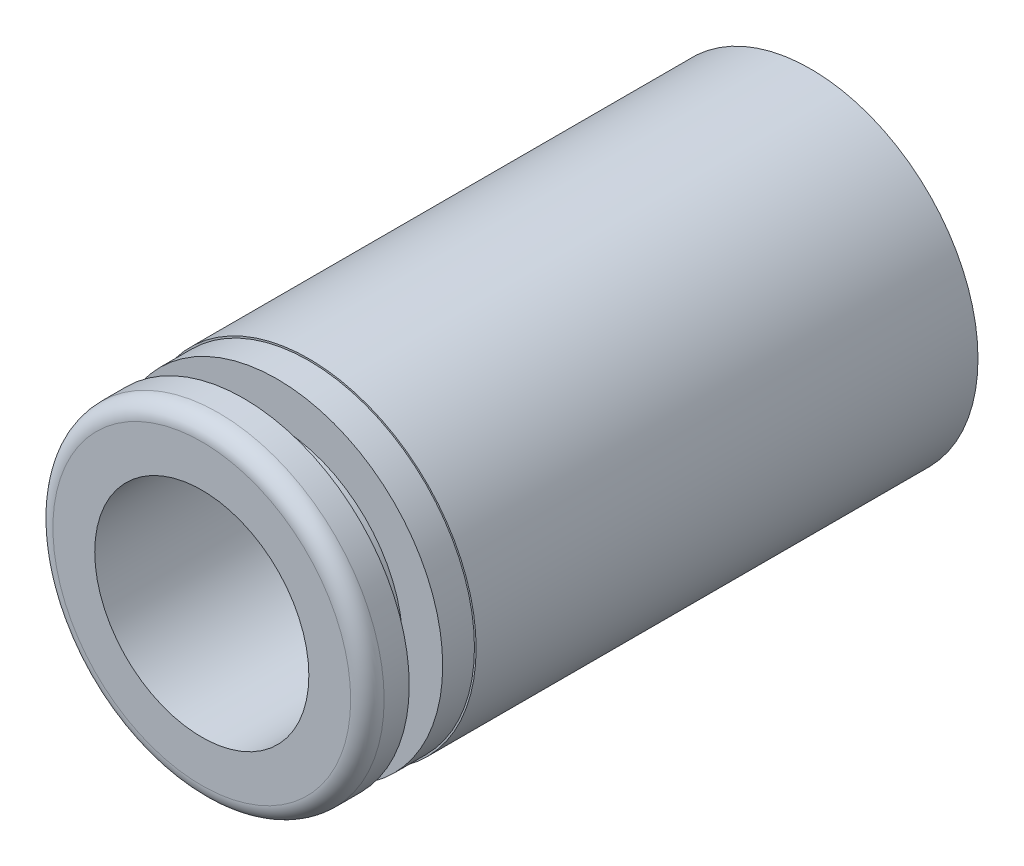
ISO-10303-21;
HEADER;
FILE_DESCRIPTION(('STEP AP214'),'2;1');
FILE_NAME('part.step','',(''),(''),'','','');
FILE_SCHEMA(('AUTOMOTIVE_DESIGN { 1 0 10303 214 1 1 1 1 }'));
ENDSEC;
DATA;
#1=APPLICATION_CONTEXT('core data for automotive mechanical design processes');
#2=APPLICATION_PROTOCOL_DEFINITION('international standard','automotive_design',2000,#1);
#3=PRODUCT_CONTEXT('',#1,'mechanical');
#4=PRODUCT('Part','Part','',(#3));
#5=PRODUCT_RELATED_PRODUCT_CATEGORY('part','',(#4));
#6=PRODUCT_DEFINITION_FORMATION('','',#4);
#7=PRODUCT_DEFINITION_CONTEXT('part definition',#1,'design');
#8=PRODUCT_DEFINITION('design','',#6,#7);
#9=PRODUCT_DEFINITION_SHAPE('','',#8);
#10=(LENGTH_UNIT() NAMED_UNIT(*) SI_UNIT(.MILLI.,.METRE.));
#11=(NAMED_UNIT(*) PLANE_ANGLE_UNIT() SI_UNIT($,.RADIAN.));
#12=(NAMED_UNIT(*) SI_UNIT($,.STERADIAN.) SOLID_ANGLE_UNIT());
#13=UNCERTAINTY_MEASURE_WITH_UNIT(LENGTH_MEASURE(1.E-05),#10,'distance_accuracy_value','');
#14=(GEOMETRIC_REPRESENTATION_CONTEXT(3) GLOBAL_UNCERTAINTY_ASSIGNED_CONTEXT((#13)) GLOBAL_UNIT_ASSIGNED_CONTEXT((#10,
#11,#12)) REPRESENTATION_CONTEXT('',''));
#15=CARTESIAN_POINT('',(0.,0.,0.));
#16=DIRECTION('',(0.,0.,1.));
#17=DIRECTION('',(1.,0.,0.));
#18=AXIS2_PLACEMENT_3D('',#15,#16,#17);
#19=CARTESIAN_POINT('',(0.,0.,15.95));
#20=DIRECTION('',(0.,0.,1.));
#21=DIRECTION('',(1.,0.,0.));
#22=AXIS2_PLACEMENT_3D('',#19,#20,#21);
#23=PLANE('',#22);
#24=CARTESIAN_POINT('',(0.,0.,15.95));
#25=DIRECTION('',(0.,0.,1.));
#26=DIRECTION('',(1.,0.,0.));
#27=AXIS2_PLACEMENT_3D('',#24,#25,#26);
#28=CIRCLE('',#27,4.95);
#29=CARTESIAN_POINT('',(-4.95,0.,15.95));
#30=VERTEX_POINT('',#29);
#31=EDGE_CURVE('E53',#30,#30,#28,.T.);
#32=ORIENTED_EDGE('',*,*,#31,.T.);
#33=EDGE_LOOP('',(#32));
#34=FACE_BOUND('',#33,.T.);
#35=CARTESIAN_POINT('',(0.,0.,15.95));
#36=DIRECTION('',(0.,0.,1.));
#37=DIRECTION('',(1.,0.,0.));
#38=AXIS2_PLACEMENT_3D('',#35,#36,#37);
#39=CIRCLE('',#38,3.75);
#40=CARTESIAN_POINT('',(3.75,0.,15.95));
#41=VERTEX_POINT('',#40);
#42=EDGE_CURVE('E60',#41,#41,#39,.T.);
#43=ORIENTED_EDGE('',*,*,#42,.F.);
#44=EDGE_LOOP('',(#43));
#45=FACE_BOUND('',#44,.T.);
#46=ADVANCED_FACE('F30',(#34,#45),#23,.T.);
#47=CARTESIAN_POINT('',(0.,0.,15.));
#48=DIRECTION('',(0.,0.,1.));
#49=DIRECTION('',(1.,0.,0.));
#50=AXIS2_PLACEMENT_3D('',#47,#48,#49);
#51=PLANE('',#50);
#52=CARTESIAN_POINT('',(0.,0.,15.));
#53=DIRECTION('',(0.,0.,1.));
#54=DIRECTION('',(1.,0.,0.));
#55=AXIS2_PLACEMENT_3D('',#52,#53,#54);
#56=CIRCLE('',#55,5.);
#57=CARTESIAN_POINT('',(5.,0.,15.));
#58=VERTEX_POINT('',#57);
#59=EDGE_CURVE('E41',#58,#58,#56,.T.);
#60=ORIENTED_EDGE('',*,*,#59,.T.);
#61=EDGE_LOOP('',(#60));
#62=FACE_BOUND('',#61,.T.);
#63=CARTESIAN_POINT('',(0.,0.,15.));
#64=DIRECTION('',(0.,0.,1.));
#65=DIRECTION('',(1.,0.,0.));
#66=AXIS2_PLACEMENT_3D('',#63,#64,#65);
#67=CIRCLE('',#66,4.95);
#68=CARTESIAN_POINT('',(-4.95,0.,15.));
#69=VERTEX_POINT('',#68);
#70=EDGE_CURVE('E54',#69,#69,#67,.T.);
#71=ORIENTED_EDGE('',*,*,#70,.F.);
#72=EDGE_LOOP('',(#71));
#73=FACE_BOUND('',#72,.T.);
#74=ADVANCED_FACE('F88',(#62,#73),#51,.T.);
#75=CARTESIAN_POINT('',(0.,0.,0.));
#76=DIRECTION('',(0.,0.,1.));
#77=DIRECTION('',(1.,0.,0.));
#78=AXIS2_PLACEMENT_3D('',#75,#76,#77);
#79=PLANE('',#78);
#80=CARTESIAN_POINT('',(0.,0.,0.));
#81=DIRECTION('',(0.,0.,1.));
#82=DIRECTION('',(1.,0.,0.));
#83=AXIS2_PLACEMENT_3D('',#80,#81,#82);
#84=CIRCLE('',#83,5.);
#85=CARTESIAN_POINT('',(5.,0.,0.));
#86=VERTEX_POINT('',#85);
#87=EDGE_CURVE('E45',#86,#86,#84,.T.);
#88=ORIENTED_EDGE('',*,*,#87,.F.);
#89=EDGE_LOOP('',(#88));
#90=FACE_BOUND('',#89,.T.);
#91=CARTESIAN_POINT('',(0.,0.,0.));
#92=DIRECTION('',(0.,0.,1.));
#93=DIRECTION('',(1.,0.,0.));
#94=AXIS2_PLACEMENT_3D('',#91,#92,#93);
#95=CIRCLE('',#94,3.2);
#96=CARTESIAN_POINT('',(3.2,0.,0.));
#97=VERTEX_POINT('',#96);
#98=EDGE_CURVE('E49',#97,#97,#95,.T.);
#99=ORIENTED_EDGE('',*,*,#98,.T.);
#100=EDGE_LOOP('',(#99));
#101=FACE_BOUND('',#100,.T.);
#102=ADVANCED_FACE('F94',(#90,#101),#79,.F.);
#103=CARTESIAN_POINT('',(0.,0.,15.));
#104=DIRECTION('',(0.,0.,-1.));
#105=DIRECTION('',(-1.,0.,0.));
#106=AXIS2_PLACEMENT_3D('',#103,#104,#105);
#107=CYLINDRICAL_SURFACE('',#106,5.);
#108=ORIENTED_EDGE('',*,*,#59,.F.);
#109=EDGE_LOOP('',(#108));
#110=FACE_BOUND('',#109,.T.);
#111=ORIENTED_EDGE('',*,*,#87,.T.);
#112=EDGE_LOOP('',(#111));
#113=FACE_BOUND('',#112,.T.);
#114=ADVANCED_FACE('F105',(#110,#113),#107,.T.);
#115=CARTESIAN_POINT('',(0.,0.,15.));
#116=DIRECTION('',(0.,0.,-1.));
#117=DIRECTION('',(-1.,0.,0.));
#118=AXIS2_PLACEMENT_3D('',#115,#116,#117);
#119=CYLINDRICAL_SURFACE('',#118,3.2);
#120=ORIENTED_EDGE('',*,*,#98,.F.);
#121=EDGE_LOOP('',(#120));
#122=FACE_BOUND('',#121,.T.);
#123=CARTESIAN_POINT('',(0.,0.,18.2));
#124=DIRECTION('',(0.,0.,1.));
#125=DIRECTION('',(1.,0.,0.));
#126=AXIS2_PLACEMENT_3D('',#123,#124,#125);
#127=CIRCLE('',#126,3.2);
#128=CARTESIAN_POINT('',(3.2,0.,18.2));
#129=VERTEX_POINT('',#128);
#130=EDGE_CURVE('E68',#129,#129,#127,.T.);
#131=ORIENTED_EDGE('',*,*,#130,.T.);
#132=EDGE_LOOP('',(#131));
#133=FACE_BOUND('',#132,.T.);
#134=ADVANCED_FACE('F72',(#122,#133),#119,.F.);
#135=CARTESIAN_POINT('',(0.,0.,15.95));
#136=DIRECTION('',(0.,0.,-1.));
#137=DIRECTION('',(-1.,0.,0.));
#138=AXIS2_PLACEMENT_3D('',#135,#136,#137);
#139=CYLINDRICAL_SURFACE('',#138,4.95);
#140=CARTESIAN_POINT('',(-4.95,0.,15.95));
#141=CARTESIAN_POINT('',(-4.95,0.,15.9401041666667));
#142=CARTESIAN_POINT('',(-4.95,0.,15.9302083333333));
#143=CARTESIAN_POINT('',(-4.95,0.,15.9104166666667));
#144=CARTESIAN_POINT('',(-4.95,0.,15.9005208333333));
#145=CARTESIAN_POINT('',(-4.95,0.,15.8807291666667));
#146=CARTESIAN_POINT('',(-4.95,0.,15.8708333333333));
#147=CARTESIAN_POINT('',(-4.95,0.,15.8510416666667));
#148=CARTESIAN_POINT('',(-4.95,0.,15.8411458333333));
#149=CARTESIAN_POINT('',(-4.95,0.,15.8213541666667));
#150=CARTESIAN_POINT('',(-4.95,0.,15.8114583333333));
#151=CARTESIAN_POINT('',(-4.95,0.,15.7916666666667));
#152=CARTESIAN_POINT('',(-4.95,0.,15.7817708333333));
#153=CARTESIAN_POINT('',(-4.95,0.,15.7619791666667));
#154=CARTESIAN_POINT('',(-4.95,0.,15.7520833333333));
#155=CARTESIAN_POINT('',(-4.95,0.,15.7322916666667));
#156=CARTESIAN_POINT('',(-4.95,0.,15.7223958333333));
#157=CARTESIAN_POINT('',(-4.95,0.,15.7026041666667));
#158=CARTESIAN_POINT('',(-4.95,0.,15.6927083333333));
#159=CARTESIAN_POINT('',(-4.95,0.,15.6729166666667));
#160=CARTESIAN_POINT('',(-4.95,0.,15.6630208333333));
#161=CARTESIAN_POINT('',(-4.95,0.,15.6432291666667));
#162=CARTESIAN_POINT('',(-4.95,0.,15.6333333333333));
#163=CARTESIAN_POINT('',(-4.95,0.,15.6135416666667));
#164=CARTESIAN_POINT('',(-4.95,0.,15.6036458333333));
#165=CARTESIAN_POINT('',(-4.95,0.,15.5838541666667));
#166=CARTESIAN_POINT('',(-4.95,0.,15.5739583333333));
#167=CARTESIAN_POINT('',(-4.95,0.,15.5541666666667));
#168=CARTESIAN_POINT('',(-4.95,0.,15.5442708333333));
#169=CARTESIAN_POINT('',(-4.95,0.,15.5244791666667));
#170=CARTESIAN_POINT('',(-4.95,0.,15.5145833333333));
#171=CARTESIAN_POINT('',(-4.95,0.,15.4947916666667));
#172=CARTESIAN_POINT('',(-4.95,0.,15.4848958333333));
#173=CARTESIAN_POINT('',(-4.95,0.,15.4651041666667));
#174=CARTESIAN_POINT('',(-4.95,0.,15.4552083333333));
#175=CARTESIAN_POINT('',(-4.95,0.,15.4354166666667));
#176=CARTESIAN_POINT('',(-4.95,0.,15.4255208333333));
#177=CARTESIAN_POINT('',(-4.95,0.,15.4057291666667));
#178=CARTESIAN_POINT('',(-4.95,0.,15.3958333333333));
#179=CARTESIAN_POINT('',(-4.95,0.,15.3760416666667));
#180=CARTESIAN_POINT('',(-4.95,0.,15.3661458333333));
#181=CARTESIAN_POINT('',(-4.95,0.,15.3463541666667));
#182=CARTESIAN_POINT('',(-4.95,0.,15.3364583333333));
#183=CARTESIAN_POINT('',(-4.95,0.,15.3166666666667));
#184=CARTESIAN_POINT('',(-4.95,0.,15.3067708333333));
#185=CARTESIAN_POINT('',(-4.95,0.,15.2869791666667));
#186=CARTESIAN_POINT('',(-4.95,0.,15.2770833333333));
#187=CARTESIAN_POINT('',(-4.95,0.,15.2572916666667));
#188=CARTESIAN_POINT('',(-4.95,0.,15.2473958333333));
#189=CARTESIAN_POINT('',(-4.95,0.,15.2276041666667));
#190=CARTESIAN_POINT('',(-4.95,0.,15.2177083333333));
#191=CARTESIAN_POINT('',(-4.95,0.,15.1979166666667));
#192=CARTESIAN_POINT('',(-4.95,0.,15.1880208333333));
#193=CARTESIAN_POINT('',(-4.95,0.,15.1682291666667));
#194=CARTESIAN_POINT('',(-4.95,0.,15.1583333333333));
#195=CARTESIAN_POINT('',(-4.95,0.,15.1385416666667));
#196=CARTESIAN_POINT('',(-4.95,0.,15.1286458333333));
#197=CARTESIAN_POINT('',(-4.95,0.,15.1088541666667));
#198=CARTESIAN_POINT('',(-4.95,0.,15.0989583333333));
#199=CARTESIAN_POINT('',(-4.95,0.,15.0791666666667));
#200=CARTESIAN_POINT('',(-4.95,0.,15.0692708333333));
#201=CARTESIAN_POINT('',(-4.95,0.,15.0494791666667));
#202=CARTESIAN_POINT('',(-4.95,0.,15.0395833333333));
#203=CARTESIAN_POINT('',(-4.95,0.,15.0197916666667));
#204=CARTESIAN_POINT('',(-4.95,0.,15.0098958333333));
#205=CARTESIAN_POINT('',(-4.95,0.,15.));
#206=B_SPLINE_CURVE_WITH_KNOTS('',3,(#140,#141,#142,#143,#144,#145,#146,#147,#148,#149,#150,
#151,#152,#153,#154,#155,#156,#157,#158,#159,#160,#161,#162,#163,#164,#165,#166,#167,#168,#169,
#170,#171,#172,#173,#174,#175,#176,#177,#178,#179,#180,#181,#182,#183,#184,#185,#186,#187,#188,
#189,#190,#191,#192,#193,#194,#195,#196,#197,#198,#199,#200,#201,#202,#203,#204,#205),
.UNSPECIFIED.,.F.,.F.,(4,2,2,2,2,2,2,2,2,2,2,2,2,2,2,2,2,2,2,2,2,2,2,2,2,2,2,2,2,2,2,2,4),(0.,
0.0296875000000002,0.0593750000000004,0.0890625000000006,0.118750000000001,0.148437500000001,
0.178125000000001,0.207812500000001,0.237500000000002,0.267187500000002,0.296875000000002,
0.3265625,0.356250000000001,0.385937500000001,0.415625000000001,0.445312500000001,
0.475000000000001,0.504687500000002,0.534375,0.5640625,0.593750000000001,0.623437500000001,
0.653125000000001,0.682812500000001,0.712500000000001,0.742187500000002,0.771875,0.8015625,
0.83125,0.860937500000001,0.890625000000001,0.920312500000001,0.950000000000001),.UNSPECIFIED.);
#207=EDGE_CURVE('BSEAM100',#30,#69,#206,.T.);
#208=ORIENTED_EDGE('',*,*,#31,.F.);
#209=ORIENTED_EDGE('',*,*,#70,.T.);
#210=ORIENTED_EDGE('',*,*,#207,.T.);
#211=ORIENTED_EDGE('',*,*,#207,.F.);
#212=EDGE_LOOP('',(#208,#210,#209,#211));
#213=FACE_BOUND('',#212,.T.);
#214=ADVANCED_FACE('F100',(#213),#139,.T.);
#215=CARTESIAN_POINT('',(0.,0.,16.95));
#216=DIRECTION('',(0.,0.,-1.));
#217=DIRECTION('',(-1.,0.,0.));
#218=AXIS2_PLACEMENT_3D('',#215,#216,#217);
#219=CYLINDRICAL_SURFACE('',#218,3.75);
#220=CARTESIAN_POINT('',(0.,0.,16.95));
#221=DIRECTION('',(0.,0.,1.));
#222=DIRECTION('',(1.,0.,0.));
#223=AXIS2_PLACEMENT_3D('',#220,#221,#222);
#224=CIRCLE('',#223,3.75);
#225=CARTESIAN_POINT('',(3.75,0.,16.95));
#226=VERTEX_POINT('',#225);
#227=EDGE_CURVE('E57',#226,#226,#224,.T.);
#228=ORIENTED_EDGE('',*,*,#227,.F.);
#229=EDGE_LOOP('',(#228));
#230=FACE_BOUND('',#229,.T.);
#231=ORIENTED_EDGE('',*,*,#42,.T.);
#232=EDGE_LOOP('',(#231));
#233=FACE_BOUND('',#232,.T.);
#234=ADVANCED_FACE('F84',(#230,#233),#219,.T.);
#235=CARTESIAN_POINT('',(0.,0.,16.95));
#236=DIRECTION('',(0.,0.,1.));
#237=DIRECTION('',(1.,0.,0.));
#238=AXIS2_PLACEMENT_3D('',#235,#236,#237);
#239=PLANE('',#238);
#240=CARTESIAN_POINT('',(0.,0.,16.95));
#241=DIRECTION('',(0.,0.,1.));
#242=DIRECTION('',(1.,0.,0.));
#243=AXIS2_PLACEMENT_3D('',#240,#241,#242);
#244=CIRCLE('',#243,4.95);
#245=CARTESIAN_POINT('',(4.95,0.,16.95));
#246=VERTEX_POINT('',#245);
#247=EDGE_CURVE('E63',#246,#246,#244,.T.);
#248=ORIENTED_EDGE('',*,*,#247,.F.);
#249=EDGE_LOOP('',(#248));
#250=FACE_BOUND('',#249,.T.);
#251=ORIENTED_EDGE('',*,*,#227,.T.);
#252=EDGE_LOOP('',(#251));
#253=FACE_BOUND('',#252,.T.);
#254=ADVANCED_FACE('F77',(#250,#253),#239,.F.);
#255=CARTESIAN_POINT('',(0.,0.,18.2));
#256=DIRECTION('',(0.,0.,1.));
#257=DIRECTION('',(1.,0.,0.));
#258=AXIS2_PLACEMENT_3D('',#255,#256,#257);
#259=PLANE('',#258);
#260=CARTESIAN_POINT('',(0.,0.,18.2));
#261=DIRECTION('',(0.,0.,1.));
#262=DIRECTION('',(1.,0.,0.));
#263=AXIS2_PLACEMENT_3D('',#260,#261,#262);
#264=CIRCLE('',#263,4.45);
#265=CARTESIAN_POINT('',(4.45,0.,18.2));
#266=VERTEX_POINT('',#265);
#267=EDGE_CURVE('E37',#266,#266,#264,.T.);
#268=ORIENTED_EDGE('',*,*,#267,.T.);
#269=EDGE_LOOP('',(#268));
#270=FACE_BOUND('',#269,.T.);
#271=ORIENTED_EDGE('',*,*,#130,.F.);
#272=EDGE_LOOP('',(#271));
#273=FACE_BOUND('',#272,.T.);
#274=ADVANCED_FACE('F74',(#270,#273),#259,.T.);
#275=CARTESIAN_POINT('',(0.,0.,18.2));
#276=DIRECTION('',(0.,0.,-1.));
#277=DIRECTION('',(-1.,0.,0.));
#278=AXIS2_PLACEMENT_3D('',#275,#276,#277);
#279=CYLINDRICAL_SURFACE('',#278,4.95);
#280=CARTESIAN_POINT('',(0.,0.,17.7));
#281=DIRECTION('',(0.,0.,1.));
#282=DIRECTION('',(1.,0.,0.));
#283=AXIS2_PLACEMENT_3D('',#280,#281,#282);
#284=CIRCLE('',#283,4.95);
#285=CARTESIAN_POINT('',(4.95,0.,17.7));
#286=VERTEX_POINT('',#285);
#287=EDGE_CURVE('E10',#286,#286,#284,.F.);
#288=ORIENTED_EDGE('',*,*,#287,.T.);
#289=EDGE_LOOP('',(#288));
#290=FACE_BOUND('',#289,.T.);
#291=ORIENTED_EDGE('',*,*,#247,.T.);
#292=EDGE_LOOP('',(#291));
#293=FACE_BOUND('',#292,.T.);
#294=ADVANCED_FACE('F76',(#290,#293),#279,.T.);
#295=CARTESIAN_POINT('',(0.,0.,17.7));
#296=DIRECTION('',(0.,0.,1.));
#297=DIRECTION('',(1.,0.,0.));
#298=AXIS2_PLACEMENT_3D('',#295,#296,#297);
#299=TOROIDAL_SURFACE('',#298,4.45,0.5);
#300=ORIENTED_EDGE('',*,*,#287,.F.);
#301=EDGE_LOOP('',(#300));
#302=FACE_BOUND('',#301,.T.);
#303=ORIENTED_EDGE('',*,*,#267,.F.);
#304=EDGE_LOOP('',(#303));
#305=FACE_BOUND('',#304,.T.);
#306=ADVANCED_FACE('F32',(#302,#305),#299,.T.);
#307=CLOSED_SHELL('',(#46,#74,#102,#114,#134,#214,#234,#254,#274,#294,#306));
#308=MANIFOLD_SOLID_BREP('B2',#307);
#309=ADVANCED_BREP_SHAPE_REPRESENTATION('',(#18,#308),#14);
#310=SHAPE_DEFINITION_REPRESENTATION(#9,#309);
ENDSEC;
END-ISO-10303-21;
